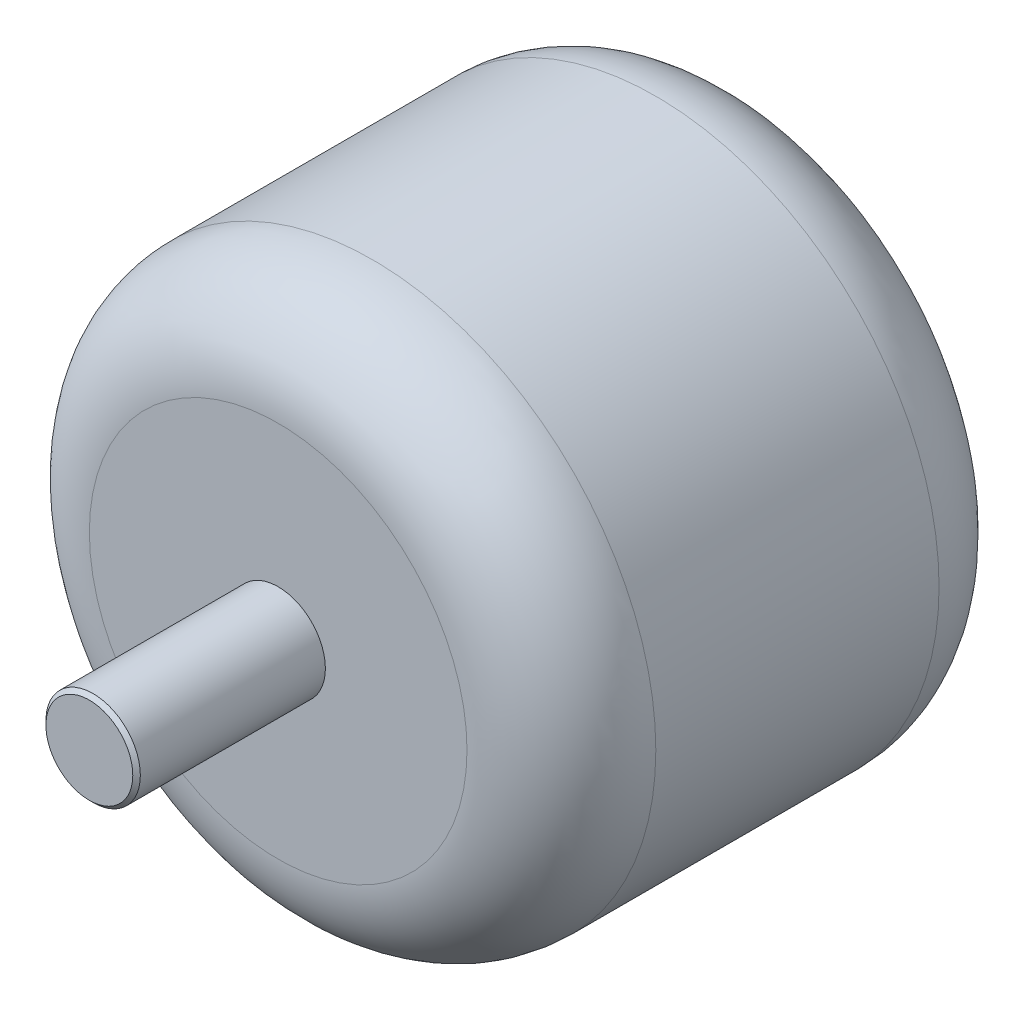
ISO-10303-21;
HEADER;
FILE_DESCRIPTION(('STEP AP214'),'2;1');
FILE_NAME('part.step','',(''),(''),'','','');
FILE_SCHEMA(('AUTOMOTIVE_DESIGN { 1 0 10303 214 1 1 1 1 }'));
ENDSEC;
DATA;
#1=APPLICATION_CONTEXT('core data for automotive mechanical design processes');
#2=APPLICATION_PROTOCOL_DEFINITION('international standard','automotive_design',2000,#1);
#3=PRODUCT_CONTEXT('',#1,'mechanical');
#4=PRODUCT('Part','Part','',(#3));
#5=PRODUCT_RELATED_PRODUCT_CATEGORY('part','',(#4));
#6=PRODUCT_DEFINITION_FORMATION('','',#4);
#7=PRODUCT_DEFINITION_CONTEXT('part definition',#1,'design');
#8=PRODUCT_DEFINITION('design','',#6,#7);
#9=PRODUCT_DEFINITION_SHAPE('','',#8);
#10=(LENGTH_UNIT() NAMED_UNIT(*) SI_UNIT(.MILLI.,.METRE.));
#11=(NAMED_UNIT(*) PLANE_ANGLE_UNIT() SI_UNIT($,.RADIAN.));
#12=(NAMED_UNIT(*) SI_UNIT($,.STERADIAN.) SOLID_ANGLE_UNIT());
#13=UNCERTAINTY_MEASURE_WITH_UNIT(LENGTH_MEASURE(1.E-05),#10,'distance_accuracy_value','');
#14=(GEOMETRIC_REPRESENTATION_CONTEXT(3) GLOBAL_UNCERTAINTY_ASSIGNED_CONTEXT((#13)) GLOBAL_UNIT_ASSIGNED_CONTEXT((#10,
#11,#12)) REPRESENTATION_CONTEXT('',''));
#15=CARTESIAN_POINT('',(0.,0.,0.));
#16=DIRECTION('',(0.,0.,1.));
#17=DIRECTION('',(1.,0.,0.));
#18=AXIS2_PLACEMENT_3D('',#15,#16,#17);
#19=CARTESIAN_POINT('',(0.,0.,-10.));
#20=DIRECTION('',(0.,0.,1.));
#21=DIRECTION('',(1.,0.,0.));
#22=AXIS2_PLACEMENT_3D('',#19,#20,#21);
#23=CYLINDRICAL_SURFACE('',#22,15.);
#24=CARTESIAN_POINT('',(0.,0.,-5.));
#25=DIRECTION('',(0.,0.,1.));
#26=DIRECTION('',(1.,0.,0.));
#27=AXIS2_PLACEMENT_3D('',#24,#25,#26);
#28=CIRCLE('',#27,15.);
#29=CARTESIAN_POINT('',(15.,0.,-5.));
#30=VERTEX_POINT('',#29);
#31=EDGE_CURVE('E54',#30,#30,#28,.T.);
#32=ORIENTED_EDGE('',*,*,#31,.T.);
#33=EDGE_LOOP('',(#32));
#34=FACE_BOUND('',#33,.T.);
#35=CARTESIAN_POINT('',(0.,0.,10.));
#36=DIRECTION('',(0.,0.,1.));
#37=DIRECTION('',(1.,0.,0.));
#38=AXIS2_PLACEMENT_3D('',#35,#36,#37);
#39=CIRCLE('',#38,15.);
#40=CARTESIAN_POINT('',(15.,0.,10.));
#41=VERTEX_POINT('',#40);
#42=EDGE_CURVE('E57',#41,#41,#39,.F.);
#43=ORIENTED_EDGE('',*,*,#42,.T.);
#44=EDGE_LOOP('',(#43));
#45=FACE_BOUND('',#44,.T.);
#46=ADVANCED_FACE('F34',(#34,#45),#23,.T.);
#47=CARTESIAN_POINT('',(0.,0.,-10.));
#48=DIRECTION('',(0.,0.,1.));
#49=DIRECTION('',(1.,0.,0.));
#50=AXIS2_PLACEMENT_3D('',#47,#48,#49);
#51=PLANE('',#50);
#52=CARTESIAN_POINT('',(-5.19615242270662,-3.00000000000002,-10.));
#53=DIRECTION('',(0.,0.,-1.));
#54=DIRECTION('',(0.500000000000004,-0.866025403784436,0.));
#55=AXIS2_PLACEMENT_3D('',#52,#53,#54);
#56=CIRCLE('',#55,1.);
#57=CARTESIAN_POINT('',(-4.69615242270662,-3.86602540378446,-10.));
#58=VERTEX_POINT('',#57);
#59=EDGE_CURVE('E76',#58,#58,#56,.T.);
#60=ORIENTED_EDGE('',*,*,#59,.F.);
#61=EDGE_LOOP('',(#60));
#62=FACE_BOUND('',#61,.T.);
#63=CARTESIAN_POINT('',(5.19615242270666,-2.99999999999995,-10.));
#64=DIRECTION('',(0.,0.,-1.));
#65=DIRECTION('',(0.499999999999992,0.866025403784443,0.));
#66=AXIS2_PLACEMENT_3D('',#63,#64,#65);
#67=CIRCLE('',#66,1.);
#68=CARTESIAN_POINT('',(5.69615242270665,-2.13397459621551,-10.));
#69=VERTEX_POINT('',#68);
#70=EDGE_CURVE('E70',#69,#69,#67,.T.);
#71=ORIENTED_EDGE('',*,*,#70,.F.);
#72=EDGE_LOOP('',(#71));
#73=FACE_BOUND('',#72,.T.);
#74=CARTESIAN_POINT('',(0.,6.,-10.));
#75=DIRECTION('',(0.,0.,-1.));
#76=DIRECTION('',(-1.,0.,0.));
#77=AXIS2_PLACEMENT_3D('',#74,#75,#76);
#78=CIRCLE('',#77,1.);
#79=CARTESIAN_POINT('',(-1.,6.,-10.));
#80=VERTEX_POINT('',#79);
#81=EDGE_CURVE('E64',#80,#80,#78,.T.);
#82=ORIENTED_EDGE('',*,*,#81,.F.);
#83=EDGE_LOOP('',(#82));
#84=FACE_BOUND('',#83,.T.);
#85=CARTESIAN_POINT('',(0.,0.,-10.));
#86=DIRECTION('',(0.,0.,1.));
#87=DIRECTION('',(1.,0.,0.));
#88=AXIS2_PLACEMENT_3D('',#85,#86,#87);
#89=CIRCLE('',#88,10.);
#90=CARTESIAN_POINT('',(10.,0.,-10.));
#91=VERTEX_POINT('',#90);
#92=EDGE_CURVE('E49',#91,#91,#89,.F.);
#93=ORIENTED_EDGE('',*,*,#92,.T.);
#94=EDGE_LOOP('',(#93));
#95=FACE_BOUND('',#94,.T.);
#96=ADVANCED_FACE('F91',(#62,#73,#84,#95),#51,.F.);
#97=CARTESIAN_POINT('',(0.,0.,15.));
#98=DIRECTION('',(0.,0.,1.));
#99=DIRECTION('',(1.,0.,0.));
#100=AXIS2_PLACEMENT_3D('',#97,#98,#99);
#101=PLANE('',#100);
#102=CARTESIAN_POINT('',(0.,0.,15.));
#103=DIRECTION('',(0.,0.,1.));
#104=DIRECTION('',(1.,0.,0.));
#105=AXIS2_PLACEMENT_3D('',#102,#103,#104);
#106=CIRCLE('',#105,2.5);
#107=CARTESIAN_POINT('',(2.5,0.,15.));
#108=VERTEX_POINT('',#107);
#109=EDGE_CURVE('E60',#108,#108,#106,.T.);
#110=ORIENTED_EDGE('',*,*,#109,.F.);
#111=EDGE_LOOP('',(#110));
#112=FACE_BOUND('',#111,.T.);
#113=CARTESIAN_POINT('',(0.,0.,15.));
#114=DIRECTION('',(0.,0.,1.));
#115=DIRECTION('',(1.,0.,0.));
#116=AXIS2_PLACEMENT_3D('',#113,#114,#115);
#117=CIRCLE('',#116,10.);
#118=CARTESIAN_POINT('',(10.,0.,15.));
#119=VERTEX_POINT('',#118);
#120=EDGE_CURVE('E45',#119,#119,#117,.T.);
#121=ORIENTED_EDGE('',*,*,#120,.T.);
#122=EDGE_LOOP('',(#121));
#123=FACE_BOUND('',#122,.T.);
#124=ADVANCED_FACE('F94',(#112,#123),#101,.T.);
#125=CARTESIAN_POINT('',(0.,0.,-5.));
#126=DIRECTION('',(0.,0.,1.));
#127=DIRECTION('',(1.,0.,0.));
#128=AXIS2_PLACEMENT_3D('',#125,#126,#127);
#129=TOROIDAL_SURFACE('',#128,10.,5.);
#130=ORIENTED_EDGE('',*,*,#92,.F.);
#131=EDGE_LOOP('',(#130));
#132=FACE_BOUND('',#131,.T.);
#133=ORIENTED_EDGE('',*,*,#31,.F.);
#134=EDGE_LOOP('',(#133));
#135=FACE_BOUND('',#134,.T.);
#136=ADVANCED_FACE('F102',(#132,#135),#129,.T.);
#137=CARTESIAN_POINT('',(0.,0.,10.));
#138=DIRECTION('',(0.,0.,1.));
#139=DIRECTION('',(1.,0.,0.));
#140=AXIS2_PLACEMENT_3D('',#137,#138,#139);
#141=TOROIDAL_SURFACE('',#140,10.,5.);
#142=ORIENTED_EDGE('',*,*,#42,.F.);
#143=EDGE_LOOP('',(#142));
#144=FACE_BOUND('',#143,.T.);
#145=ORIENTED_EDGE('',*,*,#120,.F.);
#146=EDGE_LOOP('',(#145));
#147=FACE_BOUND('',#146,.T.);
#148=ADVANCED_FACE('F105',(#144,#147),#141,.T.);
#149=CARTESIAN_POINT('',(0.,0.,25.));
#150=DIRECTION('',(0.,0.,-1.));
#151=DIRECTION('',(-1.,0.,0.));
#152=AXIS2_PLACEMENT_3D('',#149,#150,#151);
#153=CYLINDRICAL_SURFACE('',#152,2.5);
#154=CARTESIAN_POINT('',(0.,0.,24.8));
#155=DIRECTION('',(0.,0.,1.));
#156=DIRECTION('',(1.,0.,0.));
#157=AXIS2_PLACEMENT_3D('',#154,#155,#156);
#158=CIRCLE('',#157,2.5);
#159=CARTESIAN_POINT('',(2.5,0.,24.8));
#160=VERTEX_POINT('',#159);
#161=EDGE_CURVE('E10',#160,#160,#158,.F.);
#162=ORIENTED_EDGE('',*,*,#161,.T.);
#163=EDGE_LOOP('',(#162));
#164=FACE_BOUND('',#163,.T.);
#165=ORIENTED_EDGE('',*,*,#109,.T.);
#166=EDGE_LOOP('',(#165));
#167=FACE_BOUND('',#166,.T.);
#168=ADVANCED_FACE('F116',(#164,#167),#153,.T.);
#169=CARTESIAN_POINT('',(0.,0.,25.));
#170=DIRECTION('',(0.,0.,1.));
#171=DIRECTION('',(1.,0.,0.));
#172=AXIS2_PLACEMENT_3D('',#169,#170,#171);
#173=PLANE('',#172);
#174=CARTESIAN_POINT('',(0.,0.,25.));
#175=DIRECTION('',(0.,0.,1.));
#176=DIRECTION('',(1.,0.,0.));
#177=AXIS2_PLACEMENT_3D('',#174,#175,#176);
#178=CIRCLE('',#177,2.3);
#179=CARTESIAN_POINT('',(2.3,0.,25.));
#180=VERTEX_POINT('',#179);
#181=EDGE_CURVE('E41',#180,#180,#178,.T.);
#182=ORIENTED_EDGE('',*,*,#181,.T.);
#183=EDGE_LOOP('',(#182));
#184=FACE_BOUND('',#183,.T.);
#185=ADVANCED_FACE('F127',(#184),#173,.T.);
#186=CARTESIAN_POINT('',(0.,0.,25.));
#187=DIRECTION('',(0.,0.,-1.));
#188=DIRECTION('',(-1.,0.,0.));
#189=AXIS2_PLACEMENT_3D('',#186,#187,#188);
#190=CONICAL_SURFACE('',#189,2.3,0.785398163397451);
#191=ORIENTED_EDGE('',*,*,#161,.F.);
#192=EDGE_LOOP('',(#191));
#193=FACE_BOUND('',#192,.T.);
#194=ORIENTED_EDGE('',*,*,#181,.F.);
#195=EDGE_LOOP('',(#194));
#196=FACE_BOUND('',#195,.T.);
#197=ADVANCED_FACE('F36',(#193,#196),#190,.T.);
#198=CARTESIAN_POINT('',(0.,6.,-7.));
#199=DIRECTION('',(0.,0.,-1.));
#200=DIRECTION('',(-1.,0.,0.));
#201=AXIS2_PLACEMENT_3D('',#198,#199,#200);
#202=CYLINDRICAL_SURFACE('',#201,1.);
#203=CARTESIAN_POINT('',(0.,6.,-7.));
#204=DIRECTION('',(0.,0.,-1.));
#205=DIRECTION('',(-1.,0.,0.));
#206=AXIS2_PLACEMENT_3D('',#203,#204,#205);
#207=CIRCLE('',#206,1.);
#208=CARTESIAN_POINT('',(-1.,6.,-7.));
#209=VERTEX_POINT('',#208);
#210=EDGE_CURVE('E63',#209,#209,#207,.T.);
#211=ORIENTED_EDGE('',*,*,#210,.F.);
#212=EDGE_LOOP('',(#211));
#213=FACE_BOUND('',#212,.T.);
#214=ORIENTED_EDGE('',*,*,#81,.T.);
#215=EDGE_LOOP('',(#214));
#216=FACE_BOUND('',#215,.T.);
#217=ADVANCED_FACE('F130',(#213,#216),#202,.F.);
#218=CARTESIAN_POINT('',(0.,6.,-7.));
#219=DIRECTION('',(0.,0.,-1.));
#220=DIRECTION('',(-1.,0.,0.));
#221=AXIS2_PLACEMENT_3D('',#218,#219,#220);
#222=PLANE('',#221);
#223=ORIENTED_EDGE('',*,*,#210,.T.);
#224=EDGE_LOOP('',(#223));
#225=FACE_BOUND('',#224,.T.);
#226=ADVANCED_FACE('F133',(#225),#222,.T.);
#227=CARTESIAN_POINT('',(5.19615242270666,-2.99999999999995,-7.));
#228=DIRECTION('',(0.,0.,-1.));
#229=DIRECTION('',(-1.,0.,0.));
#230=AXIS2_PLACEMENT_3D('',#227,#228,#229);
#231=CYLINDRICAL_SURFACE('',#230,1.);
#232=CARTESIAN_POINT('',(5.19615242270666,-2.99999999999995,-7.));
#233=DIRECTION('',(0.,0.,-1.));
#234=DIRECTION('',(0.499999999999992,0.866025403784443,0.));
#235=AXIS2_PLACEMENT_3D('',#232,#233,#234);
#236=CIRCLE('',#235,1.);
#237=CARTESIAN_POINT('',(5.69615242270665,-2.13397459621551,-7.));
#238=VERTEX_POINT('',#237);
#239=EDGE_CURVE('E73',#238,#238,#236,.T.);
#240=ORIENTED_EDGE('',*,*,#239,.F.);
#241=EDGE_LOOP('',(#240));
#242=FACE_BOUND('',#241,.T.);
#243=ORIENTED_EDGE('',*,*,#70,.T.);
#244=EDGE_LOOP('',(#243));
#245=FACE_BOUND('',#244,.T.);
#246=ADVANCED_FACE('F137',(#242,#245),#231,.F.);
#247=CARTESIAN_POINT('',(5.19615242270666,-2.99999999999995,-7.));
#248=DIRECTION('',(0.,0.,-1.));
#249=DIRECTION('',(0.499999999999992,0.866025403784443,0.));
#250=AXIS2_PLACEMENT_3D('',#247,#248,#249);
#251=PLANE('',#250);
#252=ORIENTED_EDGE('',*,*,#239,.T.);
#253=EDGE_LOOP('',(#252));
#254=FACE_BOUND('',#253,.T.);
#255=ADVANCED_FACE('F87',(#254),#251,.T.);
#256=CARTESIAN_POINT('',(-5.19615242270662,-3.00000000000002,-7.));
#257=DIRECTION('',(0.,0.,-1.));
#258=DIRECTION('',(-1.,0.,0.));
#259=AXIS2_PLACEMENT_3D('',#256,#257,#258);
#260=CYLINDRICAL_SURFACE('',#259,1.);
#261=CARTESIAN_POINT('',(-5.19615242270662,-3.00000000000002,-7.));
#262=DIRECTION('',(0.,0.,-1.));
#263=DIRECTION('',(0.500000000000004,-0.866025403784436,0.));
#264=AXIS2_PLACEMENT_3D('',#261,#262,#263);
#265=CIRCLE('',#264,1.);
#266=CARTESIAN_POINT('',(-4.69615242270662,-3.86602540378446,-7.));
#267=VERTEX_POINT('',#266);
#268=EDGE_CURVE('E67',#267,#267,#265,.T.);
#269=ORIENTED_EDGE('',*,*,#268,.F.);
#270=EDGE_LOOP('',(#269));
#271=FACE_BOUND('',#270,.T.);
#272=ORIENTED_EDGE('',*,*,#59,.T.);
#273=EDGE_LOOP('',(#272));
#274=FACE_BOUND('',#273,.T.);
#275=ADVANCED_FACE('F84',(#271,#274),#260,.F.);
#276=CARTESIAN_POINT('',(-5.19615242270662,-3.00000000000002,-7.));
#277=DIRECTION('',(0.,0.,-1.));
#278=DIRECTION('',(0.500000000000004,-0.866025403784436,0.));
#279=AXIS2_PLACEMENT_3D('',#276,#277,#278);
#280=PLANE('',#279);
#281=ORIENTED_EDGE('',*,*,#268,.T.);
#282=EDGE_LOOP('',(#281));
#283=FACE_BOUND('',#282,.T.);
#284=ADVANCED_FACE('F82',(#283),#280,.T.);
#285=CLOSED_SHELL('',(#46,#96,#124,#136,#148,#168,#185,#197,#217,#226,#246,#255,#275,#284));
#286=MANIFOLD_SOLID_BREP('B2',#285);
#287=ADVANCED_BREP_SHAPE_REPRESENTATION('',(#18,#286),#14);
#288=SHAPE_DEFINITION_REPRESENTATION(#9,#287);
ENDSEC;
END-ISO-10303-21;
